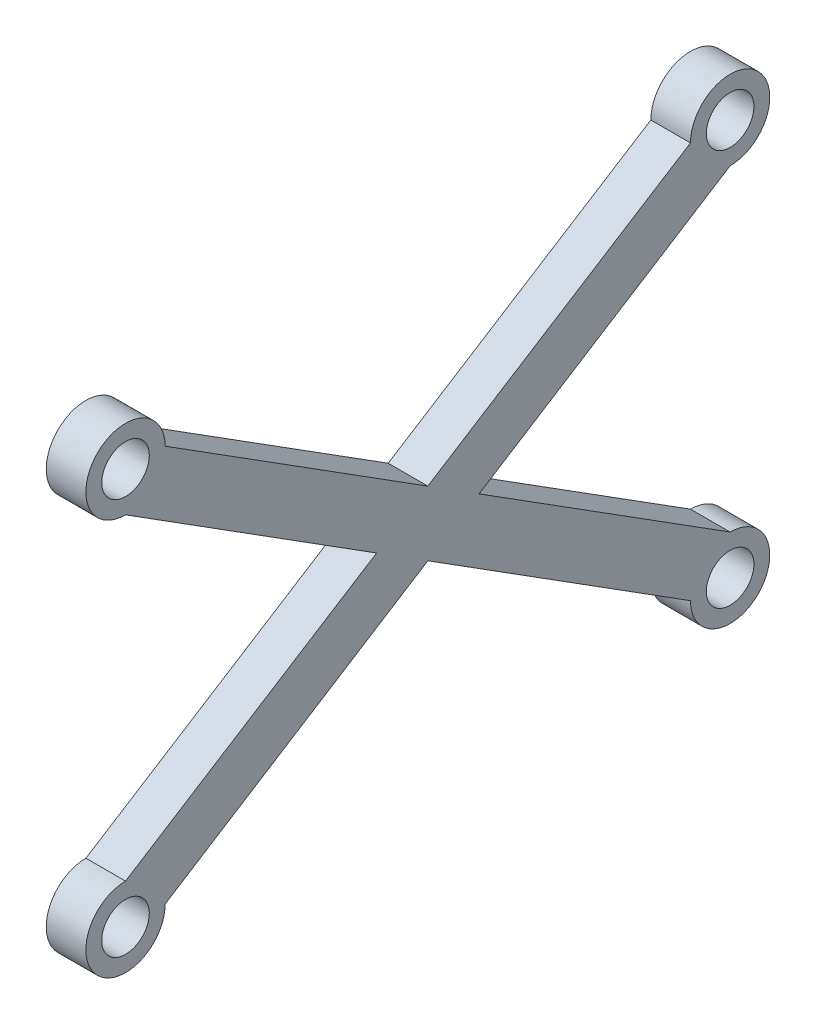
ISO-10303-21;
HEADER;
FILE_DESCRIPTION(('STEP AP214'),'2;1');
FILE_NAME('part.step','',(''),(''),'','','');
FILE_SCHEMA(('AUTOMOTIVE_DESIGN { 1 0 10303 214 1 1 1 1 }'));
ENDSEC;
DATA;
#1=APPLICATION_CONTEXT('core data for automotive mechanical design processes');
#2=APPLICATION_PROTOCOL_DEFINITION('international standard','automotive_design',2000,#1);
#3=PRODUCT_CONTEXT('',#1,'mechanical');
#4=PRODUCT('Part','Part','',(#3));
#5=PRODUCT_RELATED_PRODUCT_CATEGORY('part','',(#4));
#6=PRODUCT_DEFINITION_FORMATION('','',#4);
#7=PRODUCT_DEFINITION_CONTEXT('part definition',#1,'design');
#8=PRODUCT_DEFINITION('design','',#6,#7);
#9=PRODUCT_DEFINITION_SHAPE('','',#8);
#10=(LENGTH_UNIT() NAMED_UNIT(*) SI_UNIT(.MILLI.,.METRE.));
#11=(NAMED_UNIT(*) PLANE_ANGLE_UNIT() SI_UNIT($,.RADIAN.));
#12=(NAMED_UNIT(*) SI_UNIT($,.STERADIAN.) SOLID_ANGLE_UNIT());
#13=UNCERTAINTY_MEASURE_WITH_UNIT(LENGTH_MEASURE(1.E-05),#10,'distance_accuracy_value','');
#14=(GEOMETRIC_REPRESENTATION_CONTEXT(3) GLOBAL_UNCERTAINTY_ASSIGNED_CONTEXT((#13)) GLOBAL_UNIT_ASSIGNED_CONTEXT((#10,
#11,#12)) REPRESENTATION_CONTEXT('',''));
#15=CARTESIAN_POINT('',(0.,0.,0.));
#16=DIRECTION('',(0.,0.,1.));
#17=DIRECTION('',(1.,0.,0.));
#18=AXIS2_PLACEMENT_3D('',#15,#16,#17);
#19=CARTESIAN_POINT('',(2.,-8.,15.25));
#20=DIRECTION('',(0.,-0.845488903030967,-0.533992991387989));
#21=DIRECTION('',(0.,0.533992991387989,-0.845488903030967));
#22=AXIS2_PLACEMENT_3D('',#19,#20,#21);
#23=PLANE('',#22);
#24=DIRECTION('',(0.,-0.533992991387989,0.845488903030967));
#25=VECTOR('',#24,1.);
#26=CARTESIAN_POINT('',(0.,-8.,15.25));
#27=LINE('',#26,#25);
#28=CARTESIAN_POINT('',(0.,1.4137996329211E-13,2.58333333333334));
#29=VERTEX_POINT('',#28);
#30=CARTESIAN_POINT('',(0.,-8.,15.25));
#31=VERTEX_POINT('',#30);
#32=EDGE_CURVE('E170',#29,#31,#27,.T.);
#33=ORIENTED_EDGE('',*,*,#32,.T.);
#34=DIRECTION('',(-1.,0.,0.));
#35=VECTOR('',#34,1.);
#36=CARTESIAN_POINT('',(2.,-8.,15.25));
#37=LINE('',#36,#35);
#38=CARTESIAN_POINT('',(2.,-8.,15.25));
#39=VERTEX_POINT('',#38);
#40=EDGE_CURVE('E11',#39,#31,#37,.T.);
#41=ORIENTED_EDGE('',*,*,#40,.F.);
#42=DIRECTION('',(0.,-0.533992991387989,0.845488903030967));
#43=VECTOR('',#42,1.);
#44=CARTESIAN_POINT('',(2.,-8.,15.25));
#45=LINE('',#44,#43);
#46=CARTESIAN_POINT('',(2.,1.4137996329211E-13,2.58333333333334));
#47=VERTEX_POINT('',#46);
#48=EDGE_CURVE('E205',#47,#39,#45,.T.);
#49=ORIENTED_EDGE('',*,*,#48,.F.);
#50=DIRECTION('',(-1.,0.,0.));
#51=VECTOR('',#50,1.);
#52=CARTESIAN_POINT('',(2.,1.4137996329211E-13,2.58333333333334));
#53=LINE('',#52,#51);
#54=EDGE_CURVE('E166',#47,#29,#53,.T.);
#55=ORIENTED_EDGE('',*,*,#54,.T.);
#56=EDGE_LOOP('',(#33,#41,#49,#55));
#57=FACE_BOUND('',#56,.T.);
#58=ADVANCED_FACE('F45',(#57),#23,.F.);
#59=CARTESIAN_POINT('',(2.,-10.,15.25));
#60=DIRECTION('',(-1.,0.,0.));
#61=DIRECTION('',(0.,0.,1.));
#62=AXIS2_PLACEMENT_3D('',#59,#60,#61);
#63=CYLINDRICAL_SURFACE('',#62,2.);
#64=CARTESIAN_POINT('',(0.,-10.,15.25));
#65=DIRECTION('',(1.,0.,0.));
#66=DIRECTION('',(0.,0.,-1.));
#67=AXIS2_PLACEMENT_3D('',#64,#65,#66);
#68=CIRCLE('',#67,2.);
#69=CARTESIAN_POINT('',(0.,-10.,13.25));
#70=VERTEX_POINT('',#69);
#71=EDGE_CURVE('E174',#31,#70,#68,.T.);
#72=ORIENTED_EDGE('',*,*,#71,.T.);
#73=DIRECTION('',(-1.,0.,0.));
#74=VECTOR('',#73,1.);
#75=CARTESIAN_POINT('',(2.,-10.,13.25));
#76=LINE('',#75,#74);
#77=CARTESIAN_POINT('',(2.,-10.,13.25));
#78=VERTEX_POINT('',#77);
#79=EDGE_CURVE('E54',#78,#70,#76,.T.);
#80=ORIENTED_EDGE('',*,*,#79,.F.);
#81=CARTESIAN_POINT('',(2.,-10.,15.25));
#82=DIRECTION('',(1.,0.,0.));
#83=DIRECTION('',(0.,0.,-1.));
#84=AXIS2_PLACEMENT_3D('',#81,#82,#83);
#85=CIRCLE('',#84,2.);
#86=EDGE_CURVE('E117',#39,#78,#85,.T.);
#87=ORIENTED_EDGE('',*,*,#86,.F.);
#88=ORIENTED_EDGE('',*,*,#40,.T.);
#89=EDGE_LOOP('',(#72,#80,#87,#88));
#90=FACE_BOUND('',#89,.T.);
#91=ADVANCED_FACE('F300',(#90),#63,.T.);
#92=CARTESIAN_POINT('',(2.,-10.,13.25));
#93=DIRECTION('',(0.,0.845488903030967,0.533992991387989));
#94=DIRECTION('',(0.,-0.533992991387989,0.845488903030967));
#95=AXIS2_PLACEMENT_3D('',#92,#93,#94);
#96=PLANE('',#95);
#97=DIRECTION('',(0.,0.533992991387989,-0.845488903030967));
#98=VECTOR('',#97,1.);
#99=CARTESIAN_POINT('',(0.,-10.,13.25));
#100=LINE('',#99,#98);
#101=CARTESIAN_POINT('',(0.,-1.63157894736826,0.));
#102=VERTEX_POINT('',#101);
#103=EDGE_CURVE('E178',#70,#102,#100,.T.);
#104=ORIENTED_EDGE('',*,*,#103,.T.);
#105=DIRECTION('',(-1.,0.,0.));
#106=VECTOR('',#105,1.);
#107=CARTESIAN_POINT('',(2.,-1.63157894736826,0.));
#108=LINE('',#107,#106);
#109=CARTESIAN_POINT('',(2.,-1.63157894736826,0.));
#110=VERTEX_POINT('',#109);
#111=EDGE_CURVE('E232',#110,#102,#108,.T.);
#112=ORIENTED_EDGE('',*,*,#111,.F.);
#113=DIRECTION('',(0.,0.533992991387989,-0.845488903030967));
#114=VECTOR('',#113,1.);
#115=CARTESIAN_POINT('',(2.,-10.,13.25));
#116=LINE('',#115,#114);
#117=EDGE_CURVE('E242',#78,#110,#116,.T.);
#118=ORIENTED_EDGE('',*,*,#117,.F.);
#119=ORIENTED_EDGE('',*,*,#79,.T.);
#120=EDGE_LOOP('',(#104,#112,#118,#119));
#121=FACE_BOUND('',#120,.T.);
#122=ADVANCED_FACE('F240',(#121),#96,.F.);
#123=CARTESIAN_POINT('',(2.,-1.63157894736826,0.));
#124=DIRECTION('',(0.,0.845488903030975,-0.533992991387975));
#125=DIRECTION('',(0.,0.533992991387975,0.845488903030975));
#126=AXIS2_PLACEMENT_3D('',#123,#124,#125);
#127=PLANE('',#126);
#128=DIRECTION('',(0.,-0.533992991387975,-0.845488903030975));
#129=VECTOR('',#128,1.);
#130=CARTESIAN_POINT('',(0.,-1.63157894736826,0.));
#131=LINE('',#130,#129);
#132=CARTESIAN_POINT('',(0.,-9.99999999999968,-13.25));
#133=VERTEX_POINT('',#132);
#134=EDGE_CURVE('E181',#102,#133,#131,.T.);
#135=ORIENTED_EDGE('',*,*,#134,.T.);
#136=DIRECTION('',(-1.,0.,0.));
#137=VECTOR('',#136,1.);
#138=CARTESIAN_POINT('',(2.,-9.99999999999968,-13.25));
#139=LINE('',#138,#137);
#140=CARTESIAN_POINT('',(2.,-9.99999999999968,-13.25));
#141=VERTEX_POINT('',#140);
#142=EDGE_CURVE('E228',#141,#133,#139,.T.);
#143=ORIENTED_EDGE('',*,*,#142,.F.);
#144=DIRECTION('',(0.,-0.533992991387975,-0.845488903030975));
#145=VECTOR('',#144,1.);
#146=CARTESIAN_POINT('',(2.,-1.63157894736826,0.));
#147=LINE('',#146,#145);
#148=EDGE_CURVE('E261',#110,#141,#147,.T.);
#149=ORIENTED_EDGE('',*,*,#148,.F.);
#150=ORIENTED_EDGE('',*,*,#111,.T.);
#151=EDGE_LOOP('',(#135,#143,#149,#150));
#152=FACE_BOUND('',#151,.T.);
#153=ADVANCED_FACE('F251',(#152),#127,.F.);
#154=CARTESIAN_POINT('',(2.,-9.99999999999968,-15.25));
#155=DIRECTION('',(-1.,0.,0.));
#156=DIRECTION('',(0.,0.,1.));
#157=AXIS2_PLACEMENT_3D('',#154,#155,#156);
#158=CYLINDRICAL_SURFACE('',#157,2.);
#159=CARTESIAN_POINT('',(0.,-9.99999999999968,-15.25));
#160=DIRECTION('',(1.,0.,0.));
#161=DIRECTION('',(0.,0.,-1.));
#162=AXIS2_PLACEMENT_3D('',#159,#160,#161);
#163=CIRCLE('',#162,2.);
#164=CARTESIAN_POINT('',(0.,-7.99999999999968,-15.25));
#165=VERTEX_POINT('',#164);
#166=EDGE_CURVE('E184',#133,#165,#163,.T.);
#167=ORIENTED_EDGE('',*,*,#166,.T.);
#168=DIRECTION('',(-1.,0.,0.));
#169=VECTOR('',#168,1.);
#170=CARTESIAN_POINT('',(2.,-7.99999999999968,-15.25));
#171=LINE('',#170,#169);
#172=CARTESIAN_POINT('',(2.,-7.99999999999968,-15.25));
#173=VERTEX_POINT('',#172);
#174=EDGE_CURVE('E224',#173,#165,#171,.T.);
#175=ORIENTED_EDGE('',*,*,#174,.F.);
#176=CARTESIAN_POINT('',(2.,-9.99999999999968,-15.25));
#177=DIRECTION('',(1.,0.,0.));
#178=DIRECTION('',(0.,0.,-1.));
#179=AXIS2_PLACEMENT_3D('',#176,#177,#178);
#180=CIRCLE('',#179,2.);
#181=EDGE_CURVE('E257',#141,#173,#180,.T.);
#182=ORIENTED_EDGE('',*,*,#181,.F.);
#183=ORIENTED_EDGE('',*,*,#142,.T.);
#184=EDGE_LOOP('',(#167,#175,#182,#183));
#185=FACE_BOUND('',#184,.T.);
#186=ADVANCED_FACE('F255',(#185),#158,.T.);
#187=CARTESIAN_POINT('',(2.,-7.99999999999968,-15.25));
#188=DIRECTION('',(0.,-0.845488903030976,0.533992991387975));
#189=DIRECTION('',(0.,-0.533992991387975,-0.845488903030976));
#190=AXIS2_PLACEMENT_3D('',#187,#188,#189);
#191=PLANE('',#190);
#192=DIRECTION('',(0.,0.533992991387975,0.845488903030975));
#193=VECTOR('',#192,1.);
#194=CARTESIAN_POINT('',(0.,-7.99999999999968,-15.25));
#195=LINE('',#194,#193);
#196=CARTESIAN_POINT('',(0.,1.77809156287623E-13,-2.58333333333333));
#197=VERTEX_POINT('',#196);
#198=EDGE_CURVE('E187',#165,#197,#195,.T.);
#199=ORIENTED_EDGE('',*,*,#198,.T.);
#200=DIRECTION('',(-1.,0.,0.));
#201=VECTOR('',#200,1.);
#202=CARTESIAN_POINT('',(2.,1.77809156287623E-13,-2.58333333333333));
#203=LINE('',#202,#201);
#204=CARTESIAN_POINT('',(2.,1.77809156287623E-13,-2.58333333333333));
#205=VERTEX_POINT('',#204);
#206=EDGE_CURVE('E220',#205,#197,#203,.T.);
#207=ORIENTED_EDGE('',*,*,#206,.F.);
#208=DIRECTION('',(0.,0.533992991387975,0.845488903030975));
#209=VECTOR('',#208,1.);
#210=CARTESIAN_POINT('',(2.,-7.99999999999968,-15.25));
#211=LINE('',#210,#209);
#212=EDGE_CURVE('E260',#173,#205,#211,.T.);
#213=ORIENTED_EDGE('',*,*,#212,.F.);
#214=ORIENTED_EDGE('',*,*,#174,.T.);
#215=EDGE_LOOP('',(#199,#207,#213,#214));
#216=FACE_BOUND('',#215,.T.);
#217=ADVANCED_FACE('F313',(#216),#191,.F.);
#218=CARTESIAN_POINT('',(2.,1.77809156287623E-13,-2.58333333333333));
#219=DIRECTION('',(0.,0.845488903030967,0.533992991387988));
#220=DIRECTION('',(0.,-0.533992991387988,0.845488903030967));
#221=AXIS2_PLACEMENT_3D('',#218,#219,#220);
#222=PLANE('',#221);
#223=DIRECTION('',(0.,0.533992991387988,-0.845488903030967));
#224=VECTOR('',#223,1.);
#225=CARTESIAN_POINT('',(0.,1.77809156287623E-13,-2.58333333333333));
#226=LINE('',#225,#224);
#227=CARTESIAN_POINT('',(0.,8.00000000000032,-15.25));
#228=VERTEX_POINT('',#227);
#229=EDGE_CURVE('E190',#197,#228,#226,.T.);
#230=ORIENTED_EDGE('',*,*,#229,.T.);
#231=DIRECTION('',(-1.,0.,0.));
#232=VECTOR('',#231,1.);
#233=CARTESIAN_POINT('',(2.,8.00000000000032,-15.25));
#234=LINE('',#233,#232);
#235=CARTESIAN_POINT('',(2.,8.00000000000032,-15.25));
#236=VERTEX_POINT('',#235);
#237=EDGE_CURVE('E216',#236,#228,#234,.T.);
#238=ORIENTED_EDGE('',*,*,#237,.F.);
#239=DIRECTION('',(0.,0.533992991387988,-0.845488903030967));
#240=VECTOR('',#239,1.);
#241=CARTESIAN_POINT('',(2.,1.77809156287623E-13,-2.58333333333333));
#242=LINE('',#241,#240);
#243=EDGE_CURVE('E265',#205,#236,#242,.T.);
#244=ORIENTED_EDGE('',*,*,#243,.F.);
#245=ORIENTED_EDGE('',*,*,#206,.T.);
#246=EDGE_LOOP('',(#230,#238,#244,#245));
#247=FACE_BOUND('',#246,.T.);
#248=ADVANCED_FACE('F316',(#247),#222,.F.);
#249=CARTESIAN_POINT('',(2.,10.0000000000003,-15.25));
#250=DIRECTION('',(-1.,0.,0.));
#251=DIRECTION('',(0.,0.,1.));
#252=AXIS2_PLACEMENT_3D('',#249,#250,#251);
#253=CYLINDRICAL_SURFACE('',#252,2.);
#254=CARTESIAN_POINT('',(0.,10.0000000000003,-15.25));
#255=DIRECTION('',(1.,0.,0.));
#256=DIRECTION('',(0.,0.,-1.));
#257=AXIS2_PLACEMENT_3D('',#254,#255,#256);
#258=CIRCLE('',#257,2.);
#259=CARTESIAN_POINT('',(0.,10.0000000000003,-13.25));
#260=VERTEX_POINT('',#259);
#261=EDGE_CURVE('E193',#228,#260,#258,.T.);
#262=ORIENTED_EDGE('',*,*,#261,.T.);
#263=DIRECTION('',(-1.,0.,0.));
#264=VECTOR('',#263,1.);
#265=CARTESIAN_POINT('',(2.,10.0000000000003,-13.25));
#266=LINE('',#265,#264);
#267=CARTESIAN_POINT('',(2.,10.0000000000003,-13.25));
#268=VERTEX_POINT('',#267);
#269=EDGE_CURVE('E212',#268,#260,#266,.T.);
#270=ORIENTED_EDGE('',*,*,#269,.F.);
#271=CARTESIAN_POINT('',(2.,10.0000000000003,-15.25));
#272=DIRECTION('',(1.,0.,0.));
#273=DIRECTION('',(0.,0.,-1.));
#274=AXIS2_PLACEMENT_3D('',#271,#272,#273);
#275=CIRCLE('',#274,2.);
#276=EDGE_CURVE('E272',#236,#268,#275,.T.);
#277=ORIENTED_EDGE('',*,*,#276,.F.);
#278=ORIENTED_EDGE('',*,*,#237,.T.);
#279=EDGE_LOOP('',(#262,#270,#277,#278));
#280=FACE_BOUND('',#279,.T.);
#281=ADVANCED_FACE('F280',(#280),#253,.T.);
#282=CARTESIAN_POINT('',(2.,1.63157894736858,0.));
#283=DIRECTION('',(0.,-0.845488903030967,-0.533992991387988));
#284=DIRECTION('',(0.,0.533992991387988,-0.845488903030967));
#285=AXIS2_PLACEMENT_3D('',#282,#283,#284);
#286=PLANE('',#285);
#287=DIRECTION('',(0.,-0.533992991387988,0.845488903030967));
#288=VECTOR('',#287,1.);
#289=CARTESIAN_POINT('',(0.,1.63157894736858,0.));
#290=LINE('',#289,#288);
#291=CARTESIAN_POINT('',(0.,1.63157894736858,0.));
#292=VERTEX_POINT('',#291);
#293=EDGE_CURVE('E196',#260,#292,#290,.T.);
#294=ORIENTED_EDGE('',*,*,#293,.T.);
#295=DIRECTION('',(-1.,0.,0.));
#296=VECTOR('',#295,1.);
#297=CARTESIAN_POINT('',(2.,1.63157894736858,0.));
#298=LINE('',#297,#296);
#299=CARTESIAN_POINT('',(2.,1.63157894736858,0.));
#300=VERTEX_POINT('',#299);
#301=EDGE_CURVE('E159',#300,#292,#298,.T.);
#302=ORIENTED_EDGE('',*,*,#301,.F.);
#303=DIRECTION('',(0.,-0.533992991387988,0.845488903030967));
#304=VECTOR('',#303,1.);
#305=CARTESIAN_POINT('',(2.,1.63157894736858,0.));
#306=LINE('',#305,#304);
#307=EDGE_CURVE('E148',#268,#300,#306,.T.);
#308=ORIENTED_EDGE('',*,*,#307,.F.);
#309=ORIENTED_EDGE('',*,*,#269,.T.);
#310=EDGE_LOOP('',(#294,#302,#308,#309));
#311=FACE_BOUND('',#310,.T.);
#312=ADVANCED_FACE('F284',(#311),#286,.F.);
#313=CARTESIAN_POINT('',(2.,1.63157894736858,0.));
#314=DIRECTION('',(0.,-0.845488903030975,0.533992991387975));
#315=DIRECTION('',(0.,-0.533992991387975,-0.845488903030975));
#316=AXIS2_PLACEMENT_3D('',#313,#314,#315);
#317=PLANE('',#316);
#318=DIRECTION('',(0.,0.533992991387975,0.845488903030975));
#319=VECTOR('',#318,1.);
#320=CARTESIAN_POINT('',(0.,1.63157894736858,0.));
#321=LINE('',#320,#319);
#322=CARTESIAN_POINT('',(0.,10.,13.25));
#323=VERTEX_POINT('',#322);
#324=EDGE_CURVE('E157',#292,#323,#321,.T.);
#325=ORIENTED_EDGE('',*,*,#324,.T.);
#326=DIRECTION('',(-1.,0.,0.));
#327=VECTOR('',#326,1.);
#328=CARTESIAN_POINT('',(2.,10.,13.25));
#329=LINE('',#328,#327);
#330=CARTESIAN_POINT('',(2.,10.,13.25));
#331=VERTEX_POINT('',#330);
#332=EDGE_CURVE('E154',#331,#323,#329,.T.);
#333=ORIENTED_EDGE('',*,*,#332,.F.);
#334=DIRECTION('',(0.,0.533992991387975,0.845488903030975));
#335=VECTOR('',#334,1.);
#336=CARTESIAN_POINT('',(2.,1.63157894736858,0.));
#337=LINE('',#336,#335);
#338=EDGE_CURVE('E142',#300,#331,#337,.T.);
#339=ORIENTED_EDGE('',*,*,#338,.F.);
#340=ORIENTED_EDGE('',*,*,#301,.T.);
#341=EDGE_LOOP('',(#325,#333,#339,#340));
#342=FACE_BOUND('',#341,.T.);
#343=ADVANCED_FACE('F155',(#342),#317,.F.);
#344=CARTESIAN_POINT('',(2.,10.,15.25));
#345=DIRECTION('',(-1.,0.,0.));
#346=DIRECTION('',(0.,0.,1.));
#347=AXIS2_PLACEMENT_3D('',#344,#345,#346);
#348=CYLINDRICAL_SURFACE('',#347,2.);
#349=CARTESIAN_POINT('',(0.,10.,15.25));
#350=DIRECTION('',(1.,0.,0.));
#351=DIRECTION('',(0.,0.,-1.));
#352=AXIS2_PLACEMENT_3D('',#349,#350,#351);
#353=CIRCLE('',#352,2.);
#354=CARTESIAN_POINT('',(0.,8.,15.25));
#355=VERTEX_POINT('',#354);
#356=EDGE_CURVE('E103',#323,#355,#353,.T.);
#357=ORIENTED_EDGE('',*,*,#356,.T.);
#358=DIRECTION('',(-1.,0.,0.));
#359=VECTOR('',#358,1.);
#360=CARTESIAN_POINT('',(2.,8.,15.25));
#361=LINE('',#360,#359);
#362=CARTESIAN_POINT('',(2.,8.,15.25));
#363=VERTEX_POINT('',#362);
#364=EDGE_CURVE('E160',#363,#355,#361,.T.);
#365=ORIENTED_EDGE('',*,*,#364,.F.);
#366=CARTESIAN_POINT('',(2.,10.,15.25));
#367=DIRECTION('',(1.,0.,0.));
#368=DIRECTION('',(0.,0.,-1.));
#369=AXIS2_PLACEMENT_3D('',#366,#367,#368);
#370=CIRCLE('',#369,2.);
#371=EDGE_CURVE('E146',#331,#363,#370,.T.);
#372=ORIENTED_EDGE('',*,*,#371,.F.);
#373=ORIENTED_EDGE('',*,*,#332,.T.);
#374=EDGE_LOOP('',(#357,#365,#372,#373));
#375=FACE_BOUND('',#374,.T.);
#376=ADVANCED_FACE('F162',(#375),#348,.T.);
#377=CARTESIAN_POINT('',(2.,8.,15.25));
#378=DIRECTION('',(0.,0.845488903030975,-0.533992991387975));
#379=DIRECTION('',(0.,0.533992991387975,0.845488903030975));
#380=AXIS2_PLACEMENT_3D('',#377,#378,#379);
#381=PLANE('',#380);
#382=DIRECTION('',(0.,-0.533992991387975,-0.845488903030975));
#383=VECTOR('',#382,1.);
#384=CARTESIAN_POINT('',(0.,8.,15.25));
#385=LINE('',#384,#383);
#386=EDGE_CURVE('E109',#355,#29,#385,.T.);
#387=ORIENTED_EDGE('',*,*,#386,.T.);
#388=ORIENTED_EDGE('',*,*,#54,.F.);
#389=DIRECTION('',(0.,-0.533992991387975,-0.845488903030975));
#390=VECTOR('',#389,1.);
#391=CARTESIAN_POINT('',(2.,8.,15.25));
#392=LINE('',#391,#390);
#393=EDGE_CURVE('E62',#363,#47,#392,.T.);
#394=ORIENTED_EDGE('',*,*,#393,.F.);
#395=ORIENTED_EDGE('',*,*,#364,.T.);
#396=EDGE_LOOP('',(#387,#388,#394,#395));
#397=FACE_BOUND('',#396,.T.);
#398=ADVANCED_FACE('F288',(#397),#381,.F.);
#399=CARTESIAN_POINT('',(2.,10.,15.25));
#400=DIRECTION('',(1.,0.,0.));
#401=DIRECTION('',(0.,0.,-1.));
#402=AXIS2_PLACEMENT_3D('',#399,#400,#401);
#403=PLANE('',#402);
#404=CARTESIAN_POINT('',(2.,10.0000000000003,-15.25));
#405=DIRECTION('',(1.,0.,0.));
#406=DIRECTION('',(0.,0.,-1.));
#407=AXIS2_PLACEMENT_3D('',#404,#405,#406);
#408=CIRCLE('',#407,1.2);
#409=CARTESIAN_POINT('',(2.,10.0000000000003,-16.45));
#410=VERTEX_POINT('',#409);
#411=EDGE_CURVE('E403',#410,#410,#408,.T.);
#412=ORIENTED_EDGE('',*,*,#411,.F.);
#413=EDGE_LOOP('',(#412));
#414=FACE_BOUND('',#413,.T.);
#415=CARTESIAN_POINT('',(2.,-9.99999999999968,-15.25));
#416=DIRECTION('',(1.,0.,0.));
#417=DIRECTION('',(0.,0.,-1.));
#418=AXIS2_PLACEMENT_3D('',#415,#416,#417);
#419=CIRCLE('',#418,1.2);
#420=CARTESIAN_POINT('',(2.,-9.99999999999968,-16.45));
#421=VERTEX_POINT('',#420);
#422=EDGE_CURVE('E407',#421,#421,#419,.T.);
#423=ORIENTED_EDGE('',*,*,#422,.F.);
#424=EDGE_LOOP('',(#423));
#425=FACE_BOUND('',#424,.T.);
#426=CARTESIAN_POINT('',(2.,10.,15.25));
#427=DIRECTION('',(1.,0.,0.));
#428=DIRECTION('',(0.,0.,-1.));
#429=AXIS2_PLACEMENT_3D('',#426,#427,#428);
#430=CIRCLE('',#429,1.2);
#431=CARTESIAN_POINT('',(2.,10.,14.05));
#432=VERTEX_POINT('',#431);
#433=EDGE_CURVE('E417',#432,#432,#430,.T.);
#434=ORIENTED_EDGE('',*,*,#433,.F.);
#435=EDGE_LOOP('',(#434));
#436=FACE_BOUND('',#435,.T.);
#437=CARTESIAN_POINT('',(2.,-10.,15.25));
#438=DIRECTION('',(1.,0.,0.));
#439=DIRECTION('',(0.,0.,-1.));
#440=AXIS2_PLACEMENT_3D('',#437,#438,#439);
#441=CIRCLE('',#440,1.2);
#442=CARTESIAN_POINT('',(2.,-10.,14.05));
#443=VERTEX_POINT('',#442);
#444=EDGE_CURVE('E425',#443,#443,#441,.T.);
#445=ORIENTED_EDGE('',*,*,#444,.F.);
#446=EDGE_LOOP('',(#445));
#447=FACE_BOUND('',#446,.T.);
#448=ORIENTED_EDGE('',*,*,#48,.T.);
#449=ORIENTED_EDGE('',*,*,#86,.T.);
#450=ORIENTED_EDGE('',*,*,#117,.T.);
#451=ORIENTED_EDGE('',*,*,#148,.T.);
#452=ORIENTED_EDGE('',*,*,#181,.T.);
#453=ORIENTED_EDGE('',*,*,#212,.T.);
#454=ORIENTED_EDGE('',*,*,#243,.T.);
#455=ORIENTED_EDGE('',*,*,#276,.T.);
#456=ORIENTED_EDGE('',*,*,#307,.T.);
#457=ORIENTED_EDGE('',*,*,#338,.T.);
#458=ORIENTED_EDGE('',*,*,#371,.T.);
#459=ORIENTED_EDGE('',*,*,#393,.T.);
#460=EDGE_LOOP('',(#448,#449,#450,#451,#452,#453,#454,#455,#456,#457,#458,#459));
#461=FACE_BOUND('',#460,.T.);
#462=ADVANCED_FACE('F144',(#414,#425,#436,#447,#461),#403,.T.);
#463=CARTESIAN_POINT('',(0.,10.,15.25));
#464=DIRECTION('',(1.,0.,0.));
#465=DIRECTION('',(0.,0.,-1.));
#466=AXIS2_PLACEMENT_3D('',#463,#464,#465);
#467=PLANE('',#466);
#468=CARTESIAN_POINT('',(0.,10.0000000000003,-15.25));
#469=DIRECTION('',(1.,0.,0.));
#470=DIRECTION('',(0.,0.,-1.));
#471=AXIS2_PLACEMENT_3D('',#468,#469,#470);
#472=CIRCLE('',#471,1.2);
#473=CARTESIAN_POINT('',(0.,10.0000000000003,-16.45));
#474=VERTEX_POINT('',#473);
#475=EDGE_CURVE('E400',#474,#474,#472,.T.);
#476=ORIENTED_EDGE('',*,*,#475,.T.);
#477=EDGE_LOOP('',(#476));
#478=FACE_BOUND('',#477,.T.);
#479=CARTESIAN_POINT('',(0.,-9.99999999999968,-15.25));
#480=DIRECTION('',(1.,0.,0.));
#481=DIRECTION('',(0.,0.,-1.));
#482=AXIS2_PLACEMENT_3D('',#479,#480,#481);
#483=CIRCLE('',#482,1.2);
#484=CARTESIAN_POINT('',(0.,-9.99999999999968,-16.45));
#485=VERTEX_POINT('',#484);
#486=EDGE_CURVE('E413',#485,#485,#483,.T.);
#487=ORIENTED_EDGE('',*,*,#486,.T.);
#488=EDGE_LOOP('',(#487));
#489=FACE_BOUND('',#488,.T.);
#490=CARTESIAN_POINT('',(0.,10.,15.25));
#491=DIRECTION('',(1.,0.,0.));
#492=DIRECTION('',(0.,0.,-1.));
#493=AXIS2_PLACEMENT_3D('',#490,#491,#492);
#494=CIRCLE('',#493,1.2);
#495=CARTESIAN_POINT('',(0.,10.,14.05));
#496=VERTEX_POINT('',#495);
#497=EDGE_CURVE('E421',#496,#496,#494,.T.);
#498=ORIENTED_EDGE('',*,*,#497,.T.);
#499=EDGE_LOOP('',(#498));
#500=FACE_BOUND('',#499,.T.);
#501=CARTESIAN_POINT('',(0.,-10.,15.25));
#502=DIRECTION('',(1.,0.,0.));
#503=DIRECTION('',(0.,0.,-1.));
#504=AXIS2_PLACEMENT_3D('',#501,#502,#503);
#505=CIRCLE('',#504,1.2);
#506=CARTESIAN_POINT('',(0.,-10.,14.05));
#507=VERTEX_POINT('',#506);
#508=EDGE_CURVE('E175',#507,#507,#505,.T.);
#509=ORIENTED_EDGE('',*,*,#508,.T.);
#510=EDGE_LOOP('',(#509));
#511=FACE_BOUND('',#510,.T.);
#512=ORIENTED_EDGE('',*,*,#32,.F.);
#513=ORIENTED_EDGE('',*,*,#386,.F.);
#514=ORIENTED_EDGE('',*,*,#356,.F.);
#515=ORIENTED_EDGE('',*,*,#324,.F.);
#516=ORIENTED_EDGE('',*,*,#293,.F.);
#517=ORIENTED_EDGE('',*,*,#261,.F.);
#518=ORIENTED_EDGE('',*,*,#229,.F.);
#519=ORIENTED_EDGE('',*,*,#198,.F.);
#520=ORIENTED_EDGE('',*,*,#166,.F.);
#521=ORIENTED_EDGE('',*,*,#134,.F.);
#522=ORIENTED_EDGE('',*,*,#103,.F.);
#523=ORIENTED_EDGE('',*,*,#71,.F.);
#524=EDGE_LOOP('',(#512,#513,#514,#515,#516,#517,#518,#519,#520,#521,#522,#523));
#525=FACE_BOUND('',#524,.T.);
#526=ADVANCED_FACE('F246',(#478,#489,#500,#511,#525),#467,.F.);
#527=CARTESIAN_POINT('',(2.,-10.,15.25));
#528=DIRECTION('',(1.,0.,0.));
#529=DIRECTION('',(0.,0.,-1.));
#530=AXIS2_PLACEMENT_3D('',#527,#528,#529);
#531=CYLINDRICAL_SURFACE('',#530,1.2);
#532=ORIENTED_EDGE('',*,*,#508,.F.);
#533=EDGE_LOOP('',(#532));
#534=FACE_BOUND('',#533,.T.);
#535=ORIENTED_EDGE('',*,*,#444,.T.);
#536=EDGE_LOOP('',(#535));
#537=FACE_BOUND('',#536,.T.);
#538=ADVANCED_FACE('F355',(#534,#537),#531,.F.);
#539=CARTESIAN_POINT('',(2.,10.,15.25));
#540=DIRECTION('',(1.,0.,0.));
#541=DIRECTION('',(0.,0.,-1.));
#542=AXIS2_PLACEMENT_3D('',#539,#540,#541);
#543=CYLINDRICAL_SURFACE('',#542,1.2);
#544=ORIENTED_EDGE('',*,*,#497,.F.);
#545=EDGE_LOOP('',(#544));
#546=FACE_BOUND('',#545,.T.);
#547=ORIENTED_EDGE('',*,*,#433,.T.);
#548=EDGE_LOOP('',(#547));
#549=FACE_BOUND('',#548,.T.);
#550=ADVANCED_FACE('F364',(#546,#549),#543,.F.);
#551=CARTESIAN_POINT('',(2.,-9.99999999999968,-15.25));
#552=DIRECTION('',(1.,0.,0.));
#553=DIRECTION('',(0.,0.,-1.));
#554=AXIS2_PLACEMENT_3D('',#551,#552,#553);
#555=CYLINDRICAL_SURFACE('',#554,1.2);
#556=ORIENTED_EDGE('',*,*,#486,.F.);
#557=EDGE_LOOP('',(#556));
#558=FACE_BOUND('',#557,.T.);
#559=ORIENTED_EDGE('',*,*,#422,.T.);
#560=EDGE_LOOP('',(#559));
#561=FACE_BOUND('',#560,.T.);
#562=ADVANCED_FACE('F374',(#558,#561),#555,.F.);
#563=CARTESIAN_POINT('',(2.,10.0000000000003,-15.25));
#564=DIRECTION('',(1.,0.,0.));
#565=DIRECTION('',(0.,0.,-1.));
#566=AXIS2_PLACEMENT_3D('',#563,#564,#565);
#567=CYLINDRICAL_SURFACE('',#566,1.2);
#568=ORIENTED_EDGE('',*,*,#475,.F.);
#569=EDGE_LOOP('',(#568));
#570=FACE_BOUND('',#569,.T.);
#571=ORIENTED_EDGE('',*,*,#411,.T.);
#572=EDGE_LOOP('',(#571));
#573=FACE_BOUND('',#572,.T.);
#574=ADVANCED_FACE('F384',(#570,#573),#567,.F.);
#575=CLOSED_SHELL('',(#58,#91,#122,#153,#186,#217,#248,#281,#312,#343,#376,#398,#462,#526,#538,
#550,#562,#574));
#576=MANIFOLD_SOLID_BREP('B2',#575);
#577=ADVANCED_BREP_SHAPE_REPRESENTATION('',(#18,#576),#14);
#578=SHAPE_DEFINITION_REPRESENTATION(#9,#577);
ENDSEC;
END-ISO-10303-21;
